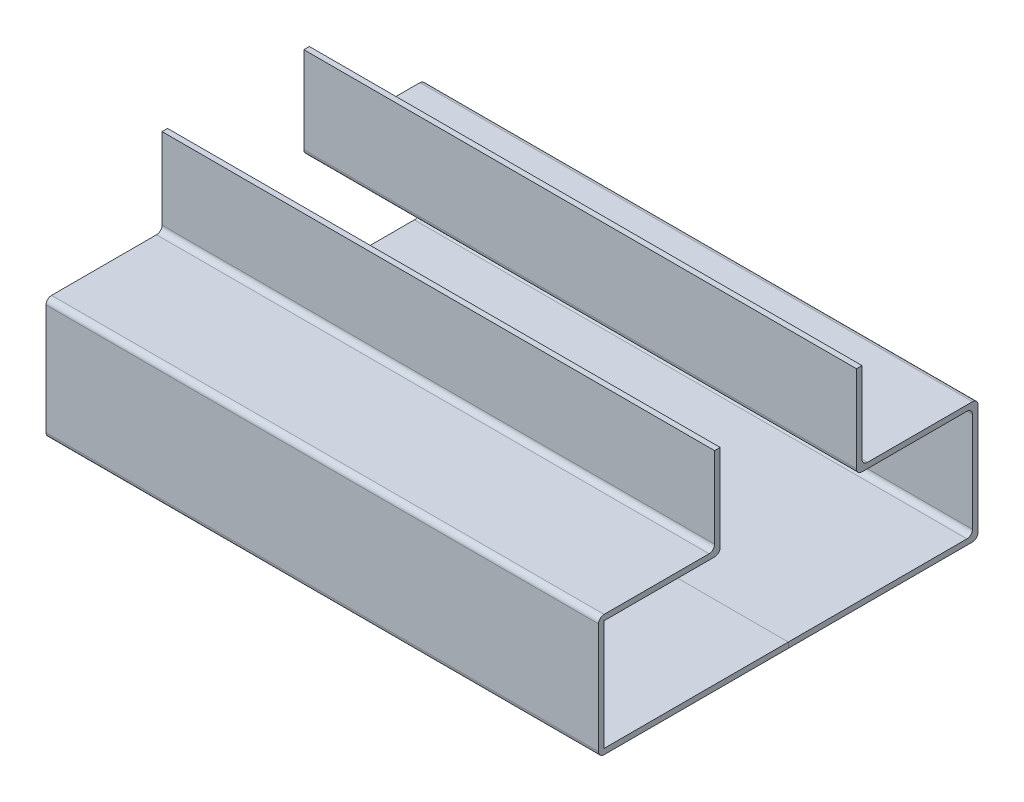
ISO-10303-21;
HEADER;
FILE_DESCRIPTION(('STEP AP214'),'2;1');
FILE_NAME('part.step','',(''),(''),'','','');
FILE_SCHEMA(('AUTOMOTIVE_DESIGN { 1 0 10303 214 1 1 1 1 }'));
ENDSEC;
DATA;
#1=APPLICATION_CONTEXT('core data for automotive mechanical design processes');
#2=APPLICATION_PROTOCOL_DEFINITION('international standard','automotive_design',2000,#1);
#3=PRODUCT_CONTEXT('',#1,'mechanical');
#4=PRODUCT('Part','Part','',(#3));
#5=PRODUCT_RELATED_PRODUCT_CATEGORY('part','',(#4));
#6=PRODUCT_DEFINITION_FORMATION('','',#4);
#7=PRODUCT_DEFINITION_CONTEXT('part definition',#1,'design');
#8=PRODUCT_DEFINITION('design','',#6,#7);
#9=PRODUCT_DEFINITION_SHAPE('','',#8);
#10=(LENGTH_UNIT() NAMED_UNIT(*) SI_UNIT(.MILLI.,.METRE.));
#11=(NAMED_UNIT(*) PLANE_ANGLE_UNIT() SI_UNIT($,.RADIAN.));
#12=(NAMED_UNIT(*) SI_UNIT($,.STERADIAN.) SOLID_ANGLE_UNIT());
#13=UNCERTAINTY_MEASURE_WITH_UNIT(LENGTH_MEASURE(1.E-05),#10,'distance_accuracy_value','');
#14=(GEOMETRIC_REPRESENTATION_CONTEXT(3) GLOBAL_UNCERTAINTY_ASSIGNED_CONTEXT((#13)) GLOBAL_UNIT_ASSIGNED_CONTEXT((#10,
#11,#12)) REPRESENTATION_CONTEXT('',''));
#15=CARTESIAN_POINT('',(0.,0.,0.));
#16=DIRECTION('',(0.,0.,1.));
#17=DIRECTION('',(1.,0.,0.));
#18=AXIS2_PLACEMENT_3D('',#15,#16,#17);
#19=CARTESIAN_POINT('',(-75.,0.,-50.));
#20=DIRECTION('',(0.,0.,1.));
#21=DIRECTION('',(-1.,0.,0.));
#22=AXIS2_PLACEMENT_3D('',#19,#20,#21);
#23=PLANE('',#22);
#24=DIRECTION('',(0.,1.,0.));
#25=VECTOR('',#24,1.);
#26=CARTESIAN_POINT('',(-75.,0.,-50.));
#27=LINE('',#26,#25);
#28=CARTESIAN_POINT('',(-75.,1.5,-50.));
#29=VERTEX_POINT('',#28);
#30=CARTESIAN_POINT('',(-75.,28.5,-50.));
#31=VERTEX_POINT('',#30);
#32=EDGE_CURVE('E228',#29,#31,#27,.T.);
#33=ORIENTED_EDGE('',*,*,#32,.F.);
#34=DIRECTION('',(1.,0.,0.));
#35=VECTOR('',#34,1.);
#36=CARTESIAN_POINT('',(-75.,1.5,-50.));
#37=LINE('',#36,#35);
#38=CARTESIAN_POINT('',(75.,1.5,-50.));
#39=VERTEX_POINT('',#38);
#40=EDGE_CURVE('E204',#29,#39,#37,.T.);
#41=ORIENTED_EDGE('',*,*,#40,.T.);
#42=DIRECTION('',(0.,1.,0.));
#43=VECTOR('',#42,1.);
#44=CARTESIAN_POINT('',(75.,0.,-50.));
#45=LINE('',#44,#43);
#46=CARTESIAN_POINT('',(75.,28.5,-50.));
#47=VERTEX_POINT('',#46);
#48=EDGE_CURVE('E217',#39,#47,#45,.T.);
#49=ORIENTED_EDGE('',*,*,#48,.T.);
#50=DIRECTION('',(1.,0.,0.));
#51=VECTOR('',#50,1.);
#52=CARTESIAN_POINT('',(-75.,28.5,-50.));
#53=LINE('',#52,#51);
#54=EDGE_CURVE('E202',#47,#31,#53,.F.);
#55=ORIENTED_EDGE('',*,*,#54,.T.);
#56=EDGE_LOOP('',(#33,#41,#49,#55));
#57=FACE_BOUND('',#56,.T.);
#58=ADVANCED_FACE('F47',(#57),#23,.T.);
#59=CARTESIAN_POINT('',(-75.,0.,0.));
#60=DIRECTION('',(0.,-1.,0.));
#61=DIRECTION('',(0.,0.,1.));
#62=AXIS2_PLACEMENT_3D('',#59,#60,#61);
#63=PLANE('',#62);
#64=DIRECTION('',(0.,0.,1.));
#65=VECTOR('',#64,1.);
#66=CARTESIAN_POINT('',(75.,0.,0.));
#67=LINE('',#66,#65);
#68=CARTESIAN_POINT('',(75.,0.,-48.5));
#69=VERTEX_POINT('',#68);
#70=CARTESIAN_POINT('',(75.,0.,0.));
#71=VERTEX_POINT('',#70);
#72=EDGE_CURVE('E231',#69,#71,#67,.T.);
#73=ORIENTED_EDGE('',*,*,#72,.F.);
#74=DIRECTION('',(1.,0.,0.));
#75=VECTOR('',#74,1.);
#76=CARTESIAN_POINT('',(-75.,0.,-48.5));
#77=LINE('',#76,#75);
#78=CARTESIAN_POINT('',(-75.,0.,-48.5));
#79=VERTEX_POINT('',#78);
#80=EDGE_CURVE('E207',#69,#79,#77,.F.);
#81=ORIENTED_EDGE('',*,*,#80,.T.);
#82=DIRECTION('',(0.,0.,1.));
#83=VECTOR('',#82,1.);
#84=CARTESIAN_POINT('',(-75.,0.,0.));
#85=LINE('',#84,#83);
#86=CARTESIAN_POINT('',(-75.,0.,0.));
#87=VERTEX_POINT('',#86);
#88=EDGE_CURVE('E185',#79,#87,#85,.T.);
#89=ORIENTED_EDGE('',*,*,#88,.T.);
#90=DIRECTION('',(1.,0.,0.));
#91=VECTOR('',#90,1.);
#92=CARTESIAN_POINT('',(-75.,0.,0.));
#93=LINE('',#92,#91);
#94=EDGE_CURVE('E195',#87,#71,#93,.T.);
#95=ORIENTED_EDGE('',*,*,#94,.T.);
#96=EDGE_LOOP('',(#73,#81,#89,#95));
#97=FACE_BOUND('',#96,.T.);
#98=ADVANCED_FACE('F308',(#97),#63,.F.);
#99=CARTESIAN_POINT('',(-75.,0.,0.));
#100=DIRECTION('',(0.,0.,1.));
#101=DIRECTION('',(-1.,0.,0.));
#102=AXIS2_PLACEMENT_3D('',#99,#100,#101);
#103=PLANE('',#102);
#104=ORIENTED_EDGE('',*,*,#94,.F.);
#105=DIRECTION('',(0.,1.,0.));
#106=VECTOR('',#105,1.);
#107=CARTESIAN_POINT('',(-75.,0.,0.));
#108=LINE('',#107,#106);
#109=CARTESIAN_POINT('',(-75.,-1.5,0.));
#110=VERTEX_POINT('',#109);
#111=EDGE_CURVE('E189',#110,#87,#108,.T.);
#112=ORIENTED_EDGE('',*,*,#111,.F.);
#113=DIRECTION('',(1.,0.,0.));
#114=VECTOR('',#113,1.);
#115=CARTESIAN_POINT('',(-75.,-1.5,0.));
#116=LINE('',#115,#114);
#117=CARTESIAN_POINT('',(75.,-1.5,0.));
#118=VERTEX_POINT('',#117);
#119=EDGE_CURVE('E255',#110,#118,#116,.T.);
#120=ORIENTED_EDGE('',*,*,#119,.T.);
#121=DIRECTION('',(0.,1.,0.));
#122=VECTOR('',#121,1.);
#123=CARTESIAN_POINT('',(75.,0.,0.));
#124=LINE('',#123,#122);
#125=EDGE_CURVE('E296',#118,#71,#124,.T.);
#126=ORIENTED_EDGE('',*,*,#125,.T.);
#127=EDGE_LOOP('',(#104,#112,#120,#126));
#128=FACE_BOUND('',#127,.T.);
#129=ADVANCED_FACE('F305',(#128),#103,.T.);
#130=CARTESIAN_POINT('',(-75.,-1.5,0.));
#131=DIRECTION('',(0.,-1.,0.));
#132=DIRECTION('',(0.,0.,1.));
#133=AXIS2_PLACEMENT_3D('',#130,#131,#132);
#134=PLANE('',#133);
#135=ORIENTED_EDGE('',*,*,#119,.F.);
#136=DIRECTION('',(0.,0.,1.));
#137=VECTOR('',#136,1.);
#138=CARTESIAN_POINT('',(-75.,-1.5,0.));
#139=LINE('',#138,#137);
#140=CARTESIAN_POINT('',(-75.,-1.5,-50.));
#141=VERTEX_POINT('',#140);
#142=EDGE_CURVE('E249',#141,#110,#139,.T.);
#143=ORIENTED_EDGE('',*,*,#142,.F.);
#144=DIRECTION('',(1.,0.,0.));
#145=VECTOR('',#144,1.);
#146=CARTESIAN_POINT('',(-75.,-1.5,-50.));
#147=LINE('',#146,#145);
#148=CARTESIAN_POINT('',(75.,-1.5,-50.));
#149=VERTEX_POINT('',#148);
#150=EDGE_CURVE('E258',#141,#149,#147,.T.);
#151=ORIENTED_EDGE('',*,*,#150,.T.);
#152=DIRECTION('',(0.,0.,1.));
#153=VECTOR('',#152,1.);
#154=CARTESIAN_POINT('',(75.,-1.5,0.));
#155=LINE('',#154,#153);
#156=EDGE_CURVE('E294',#149,#118,#155,.T.);
#157=ORIENTED_EDGE('',*,*,#156,.T.);
#158=EDGE_LOOP('',(#135,#143,#151,#157));
#159=FACE_BOUND('',#158,.T.);
#160=ADVANCED_FACE('F316',(#159),#134,.T.);
#161=CARTESIAN_POINT('',(-75.,0.,-50.));
#162=DIRECTION('',(1.,0.,0.));
#163=DIRECTION('',(0.,0.,1.));
#164=AXIS2_PLACEMENT_3D('',#161,#162,#163);
#165=CYLINDRICAL_SURFACE('',#164,1.5);
#166=ORIENTED_EDGE('',*,*,#150,.F.);
#167=CARTESIAN_POINT('',(-75.,0.,-50.));
#168=DIRECTION('',(-1.,0.,0.));
#169=DIRECTION('',(0.,0.,1.));
#170=AXIS2_PLACEMENT_3D('',#167,#168,#169);
#171=CIRCLE('',#170,1.5);
#172=CARTESIAN_POINT('',(-75.,0.,-51.5));
#173=VERTEX_POINT('',#172);
#174=EDGE_CURVE('E247',#173,#141,#171,.T.);
#175=ORIENTED_EDGE('',*,*,#174,.F.);
#176=DIRECTION('',(1.,0.,0.));
#177=VECTOR('',#176,1.);
#178=CARTESIAN_POINT('',(-75.,0.,-51.5));
#179=LINE('',#178,#177);
#180=CARTESIAN_POINT('',(75.,0.,-51.5));
#181=VERTEX_POINT('',#180);
#182=EDGE_CURVE('E261',#173,#181,#179,.T.);
#183=ORIENTED_EDGE('',*,*,#182,.T.);
#184=CARTESIAN_POINT('',(75.,0.,-50.));
#185=DIRECTION('',(-1.,0.,0.));
#186=DIRECTION('',(0.,0.,1.));
#187=AXIS2_PLACEMENT_3D('',#184,#185,#186);
#188=CIRCLE('',#187,1.5);
#189=EDGE_CURVE('E292',#181,#149,#188,.T.);
#190=ORIENTED_EDGE('',*,*,#189,.T.);
#191=EDGE_LOOP('',(#166,#175,#183,#190));
#192=FACE_BOUND('',#191,.T.);
#193=ADVANCED_FACE('F321',(#192),#165,.T.);
#194=CARTESIAN_POINT('',(-75.,0.,-51.5));
#195=DIRECTION('',(0.,0.,-1.));
#196=DIRECTION('',(1.,0.,0.));
#197=AXIS2_PLACEMENT_3D('',#194,#195,#196);
#198=PLANE('',#197);
#199=ORIENTED_EDGE('',*,*,#182,.F.);
#200=DIRECTION('',(0.,-1.,0.));
#201=VECTOR('',#200,1.);
#202=CARTESIAN_POINT('',(-75.,0.,-51.5));
#203=LINE('',#202,#201);
#204=CARTESIAN_POINT('',(-75.,30.,-51.5));
#205=VERTEX_POINT('',#204);
#206=EDGE_CURVE('E245',#205,#173,#203,.T.);
#207=ORIENTED_EDGE('',*,*,#206,.F.);
#208=DIRECTION('',(1.,0.,0.));
#209=VECTOR('',#208,1.);
#210=CARTESIAN_POINT('',(-75.,30.,-51.5));
#211=LINE('',#210,#209);
#212=CARTESIAN_POINT('',(75.,30.,-51.5));
#213=VERTEX_POINT('',#212);
#214=EDGE_CURVE('E264',#205,#213,#211,.T.);
#215=ORIENTED_EDGE('',*,*,#214,.T.);
#216=DIRECTION('',(0.,-1.,0.));
#217=VECTOR('',#216,1.);
#218=CARTESIAN_POINT('',(75.,0.,-51.5));
#219=LINE('',#218,#217);
#220=EDGE_CURVE('E290',#213,#181,#219,.T.);
#221=ORIENTED_EDGE('',*,*,#220,.T.);
#222=EDGE_LOOP('',(#199,#207,#215,#221));
#223=FACE_BOUND('',#222,.T.);
#224=ADVANCED_FACE('F324',(#223),#198,.T.);
#225=CARTESIAN_POINT('',(-75.,30.,-50.));
#226=DIRECTION('',(1.,0.,0.));
#227=DIRECTION('',(0.,0.,1.));
#228=AXIS2_PLACEMENT_3D('',#225,#226,#227);
#229=CYLINDRICAL_SURFACE('',#228,1.50000000000002);
#230=ORIENTED_EDGE('',*,*,#214,.F.);
#231=CARTESIAN_POINT('',(-75.,30.,-50.));
#232=DIRECTION('',(-1.,0.,0.));
#233=DIRECTION('',(0.,0.,1.));
#234=AXIS2_PLACEMENT_3D('',#231,#232,#233);
#235=CIRCLE('',#234,1.50000000000002);
#236=CARTESIAN_POINT('',(-75.,31.5,-50.));
#237=VERTEX_POINT('',#236);
#238=EDGE_CURVE('E243',#237,#205,#235,.T.);
#239=ORIENTED_EDGE('',*,*,#238,.F.);
#240=DIRECTION('',(1.,0.,0.));
#241=VECTOR('',#240,1.);
#242=CARTESIAN_POINT('',(-75.,31.5,-50.));
#243=LINE('',#242,#241);
#244=CARTESIAN_POINT('',(75.,31.5,-50.));
#245=VERTEX_POINT('',#244);
#246=EDGE_CURVE('E267',#237,#245,#243,.T.);
#247=ORIENTED_EDGE('',*,*,#246,.T.);
#248=CARTESIAN_POINT('',(75.,30.,-50.));
#249=DIRECTION('',(-1.,0.,0.));
#250=DIRECTION('',(0.,0.,1.));
#251=AXIS2_PLACEMENT_3D('',#248,#249,#250);
#252=CIRCLE('',#251,1.50000000000002);
#253=EDGE_CURVE('E286',#245,#213,#252,.T.);
#254=ORIENTED_EDGE('',*,*,#253,.T.);
#255=EDGE_LOOP('',(#230,#239,#247,#254));
#256=FACE_BOUND('',#255,.T.);
#257=ADVANCED_FACE('F328',(#256),#229,.T.);
#258=CARTESIAN_POINT('',(-75.,31.5,0.));
#259=DIRECTION('',(0.,1.,0.));
#260=DIRECTION('',(0.,0.,-1.));
#261=AXIS2_PLACEMENT_3D('',#258,#259,#260);
#262=PLANE('',#261);
#263=ORIENTED_EDGE('',*,*,#246,.F.);
#264=DIRECTION('',(0.,0.,-1.));
#265=VECTOR('',#264,1.);
#266=CARTESIAN_POINT('',(-75.,31.5,0.));
#267=LINE('',#266,#265);
#268=CARTESIAN_POINT('',(-75.,31.5,-21.5));
#269=VERTEX_POINT('',#268);
#270=EDGE_CURVE('E241',#269,#237,#267,.T.);
#271=ORIENTED_EDGE('',*,*,#270,.F.);
#272=DIRECTION('',(1.,0.,0.));
#273=VECTOR('',#272,1.);
#274=CARTESIAN_POINT('',(-75.,31.5,-21.5));
#275=LINE('',#274,#273);
#276=CARTESIAN_POINT('',(75.,31.5,-21.5));
#277=VERTEX_POINT('',#276);
#278=EDGE_CURVE('E270',#269,#277,#275,.T.);
#279=ORIENTED_EDGE('',*,*,#278,.T.);
#280=DIRECTION('',(0.,0.,-1.));
#281=VECTOR('',#280,1.);
#282=CARTESIAN_POINT('',(75.,31.5,0.));
#283=LINE('',#282,#281);
#284=EDGE_CURVE('E284',#277,#245,#283,.T.);
#285=ORIENTED_EDGE('',*,*,#284,.T.);
#286=EDGE_LOOP('',(#263,#271,#279,#285));
#287=FACE_BOUND('',#286,.T.);
#288=ADVANCED_FACE('F332',(#287),#262,.T.);
#289=CARTESIAN_POINT('',(-75.,33.,-21.5));
#290=DIRECTION('',(1.,0.,0.));
#291=DIRECTION('',(0.,0.,1.));
#292=AXIS2_PLACEMENT_3D('',#289,#290,#291);
#293=CYLINDRICAL_SURFACE('',#292,1.49999999999998);
#294=ORIENTED_EDGE('',*,*,#278,.F.);
#295=CARTESIAN_POINT('',(-75.,33.,-21.5));
#296=DIRECTION('',(-1.,0.,0.));
#297=DIRECTION('',(0.,0.,1.));
#298=AXIS2_PLACEMENT_3D('',#295,#296,#297);
#299=CIRCLE('',#298,1.49999999999998);
#300=CARTESIAN_POINT('',(-75.,33.,-20.));
#301=VERTEX_POINT('',#300);
#302=EDGE_CURVE('E238',#269,#301,#299,.T.);
#303=ORIENTED_EDGE('',*,*,#302,.T.);
#304=DIRECTION('',(1.,0.,0.));
#305=VECTOR('',#304,1.);
#306=CARTESIAN_POINT('',(-75.,33.,-20.));
#307=LINE('',#306,#305);
#308=CARTESIAN_POINT('',(75.,33.,-20.));
#309=VERTEX_POINT('',#308);
#310=EDGE_CURVE('E187',#301,#309,#307,.T.);
#311=ORIENTED_EDGE('',*,*,#310,.T.);
#312=CARTESIAN_POINT('',(75.,33.,-21.5));
#313=DIRECTION('',(-1.,0.,0.));
#314=DIRECTION('',(0.,0.,1.));
#315=AXIS2_PLACEMENT_3D('',#312,#313,#314);
#316=CIRCLE('',#315,1.49999999999998);
#317=EDGE_CURVE('E277',#277,#309,#316,.T.);
#318=ORIENTED_EDGE('',*,*,#317,.F.);
#319=EDGE_LOOP('',(#294,#303,#311,#318));
#320=FACE_BOUND('',#319,.T.);
#321=ADVANCED_FACE('F276',(#320),#293,.F.);
#322=CARTESIAN_POINT('',(-75.,0.,-20.));
#323=DIRECTION('',(0.,0.,-1.));
#324=DIRECTION('',(1.,0.,0.));
#325=AXIS2_PLACEMENT_3D('',#322,#323,#324);
#326=PLANE('',#325);
#327=ORIENTED_EDGE('',*,*,#310,.F.);
#328=DIRECTION('',(0.,-1.,0.));
#329=VECTOR('',#328,1.);
#330=CARTESIAN_POINT('',(-75.,0.,-20.));
#331=LINE('',#330,#329);
#332=CARTESIAN_POINT('',(-75.,55.,-20.));
#333=VERTEX_POINT('',#332);
#334=EDGE_CURVE('E236',#333,#301,#331,.T.);
#335=ORIENTED_EDGE('',*,*,#334,.F.);
#336=DIRECTION('',(1.,0.,0.));
#337=VECTOR('',#336,1.);
#338=CARTESIAN_POINT('',(-75.,55.,-20.));
#339=LINE('',#338,#337);
#340=CARTESIAN_POINT('',(75.,55.,-20.));
#341=VERTEX_POINT('',#340);
#342=EDGE_CURVE('E184',#333,#341,#339,.T.);
#343=ORIENTED_EDGE('',*,*,#342,.T.);
#344=DIRECTION('',(0.,-1.,0.));
#345=VECTOR('',#344,1.);
#346=CARTESIAN_POINT('',(75.,0.,-20.));
#347=LINE('',#346,#345);
#348=EDGE_CURVE('E177',#341,#309,#347,.T.);
#349=ORIENTED_EDGE('',*,*,#348,.T.);
#350=EDGE_LOOP('',(#327,#335,#343,#349));
#351=FACE_BOUND('',#350,.T.);
#352=ADVANCED_FACE('F281',(#351),#326,.T.);
#353=CARTESIAN_POINT('',(-75.,55.,0.));
#354=DIRECTION('',(0.,1.,0.));
#355=DIRECTION('',(0.,0.,-1.));
#356=AXIS2_PLACEMENT_3D('',#353,#354,#355);
#357=PLANE('',#356);
#358=ORIENTED_EDGE('',*,*,#342,.F.);
#359=DIRECTION('',(0.,0.,-1.));
#360=VECTOR('',#359,1.);
#361=CARTESIAN_POINT('',(-75.,55.,0.));
#362=LINE('',#361,#360);
#363=CARTESIAN_POINT('',(-75.,55.,-18.5));
#364=VERTEX_POINT('',#363);
#365=EDGE_CURVE('E183',#364,#333,#362,.T.);
#366=ORIENTED_EDGE('',*,*,#365,.F.);
#367=DIRECTION('',(1.,0.,0.));
#368=VECTOR('',#367,1.);
#369=CARTESIAN_POINT('',(-75.,55.,-18.5));
#370=LINE('',#369,#368);
#371=CARTESIAN_POINT('',(75.,55.,-18.5));
#372=VERTEX_POINT('',#371);
#373=EDGE_CURVE('E165',#364,#372,#370,.T.);
#374=ORIENTED_EDGE('',*,*,#373,.T.);
#375=DIRECTION('',(0.,0.,-1.));
#376=VECTOR('',#375,1.);
#377=CARTESIAN_POINT('',(75.,55.,0.));
#378=LINE('',#377,#376);
#379=EDGE_CURVE('E171',#372,#341,#378,.T.);
#380=ORIENTED_EDGE('',*,*,#379,.T.);
#381=EDGE_LOOP('',(#358,#366,#374,#380));
#382=FACE_BOUND('',#381,.T.);
#383=ADVANCED_FACE('F182',(#382),#357,.T.);
#384=CARTESIAN_POINT('',(-75.,0.,-18.5));
#385=DIRECTION('',(0.,0.,1.));
#386=DIRECTION('',(-1.,0.,0.));
#387=AXIS2_PLACEMENT_3D('',#384,#385,#386);
#388=PLANE('',#387);
#389=DIRECTION('',(0.,1.,0.));
#390=VECTOR('',#389,1.);
#391=CARTESIAN_POINT('',(-75.,0.,-18.5));
#392=LINE('',#391,#390);
#393=CARTESIAN_POINT('',(-75.,31.5,-18.5));
#394=VERTEX_POINT('',#393);
#395=EDGE_CURVE('E227',#394,#364,#392,.T.);
#396=ORIENTED_EDGE('',*,*,#395,.F.);
#397=DIRECTION('',(1.,0.,0.));
#398=VECTOR('',#397,1.);
#399=CARTESIAN_POINT('',(-75.,31.5,-18.5));
#400=LINE('',#399,#398);
#401=CARTESIAN_POINT('',(75.,31.5,-18.5));
#402=VERTEX_POINT('',#401);
#403=EDGE_CURVE('E168',#394,#402,#400,.T.);
#404=ORIENTED_EDGE('',*,*,#403,.T.);
#405=DIRECTION('',(0.,1.,0.));
#406=VECTOR('',#405,1.);
#407=CARTESIAN_POINT('',(75.,0.,-18.5));
#408=LINE('',#407,#406);
#409=EDGE_CURVE('E160',#402,#372,#408,.T.);
#410=ORIENTED_EDGE('',*,*,#409,.T.);
#411=ORIENTED_EDGE('',*,*,#373,.F.);
#412=EDGE_LOOP('',(#396,#404,#410,#411));
#413=FACE_BOUND('',#412,.T.);
#414=ADVANCED_FACE('F163',(#413),#388,.T.);
#415=CARTESIAN_POINT('',(-75.,30.,0.));
#416=DIRECTION('',(0.,-1.,0.));
#417=DIRECTION('',(0.,0.,1.));
#418=AXIS2_PLACEMENT_3D('',#415,#416,#417);
#419=PLANE('',#418);
#420=DIRECTION('',(0.,0.,1.));
#421=VECTOR('',#420,1.);
#422=CARTESIAN_POINT('',(-75.,30.,0.));
#423=LINE('',#422,#421);
#424=CARTESIAN_POINT('',(-75.,30.,-48.5));
#425=VERTEX_POINT('',#424);
#426=CARTESIAN_POINT('',(-75.,30.,-20.));
#427=VERTEX_POINT('',#426);
#428=EDGE_CURVE('E224',#425,#427,#423,.T.);
#429=ORIENTED_EDGE('',*,*,#428,.F.);
#430=DIRECTION('',(1.,0.,0.));
#431=VECTOR('',#430,1.);
#432=CARTESIAN_POINT('',(75.,30.,-48.5));
#433=LINE('',#432,#431);
#434=CARTESIAN_POINT('',(75.,30.,-48.5));
#435=VERTEX_POINT('',#434);
#436=EDGE_CURVE('E209',#425,#435,#433,.T.);
#437=ORIENTED_EDGE('',*,*,#436,.T.);
#438=DIRECTION('',(0.,0.,1.));
#439=VECTOR('',#438,1.);
#440=CARTESIAN_POINT('',(75.,30.,0.));
#441=LINE('',#440,#439);
#442=CARTESIAN_POINT('',(75.,30.,-20.));
#443=VERTEX_POINT('',#442);
#444=EDGE_CURVE('E172',#435,#443,#441,.T.);
#445=ORIENTED_EDGE('',*,*,#444,.T.);
#446=DIRECTION('',(1.,0.,0.));
#447=VECTOR('',#446,1.);
#448=CARTESIAN_POINT('',(-75.,30.,-20.));
#449=LINE('',#448,#447);
#450=EDGE_CURVE('E197',#443,#427,#449,.F.);
#451=ORIENTED_EDGE('',*,*,#450,.T.);
#452=EDGE_LOOP('',(#429,#437,#445,#451));
#453=FACE_BOUND('',#452,.T.);
#454=ADVANCED_FACE('F223',(#453),#419,.T.);
#455=CARTESIAN_POINT('',(-75.,0.,0.));
#456=DIRECTION('',(1.,0.,0.));
#457=DIRECTION('',(0.,0.,1.));
#458=AXIS2_PLACEMENT_3D('',#455,#456,#457);
#459=PLANE('',#458);
#460=ORIENTED_EDGE('',*,*,#32,.T.);
#461=CARTESIAN_POINT('',(-75.,28.5,-48.5));
#462=DIRECTION('',(1.,0.,0.));
#463=DIRECTION('',(0.,0.,-1.));
#464=AXIS2_PLACEMENT_3D('',#461,#462,#463);
#465=CIRCLE('',#464,1.5);
#466=EDGE_CURVE('E12',#31,#425,#465,.T.);
#467=ORIENTED_EDGE('',*,*,#466,.T.);
#468=ORIENTED_EDGE('',*,*,#428,.T.);
#469=CARTESIAN_POINT('',(-75.,31.5,-20.));
#470=DIRECTION('',(1.,0.,0.));
#471=DIRECTION('',(0.,0.,-1.));
#472=AXIS2_PLACEMENT_3D('',#469,#470,#471);
#473=CIRCLE('',#472,1.5);
#474=EDGE_CURVE('E200',#427,#394,#473,.F.);
#475=ORIENTED_EDGE('',*,*,#474,.T.);
#476=ORIENTED_EDGE('',*,*,#395,.T.);
#477=ORIENTED_EDGE('',*,*,#365,.T.);
#478=ORIENTED_EDGE('',*,*,#334,.T.);
#479=ORIENTED_EDGE('',*,*,#302,.F.);
#480=ORIENTED_EDGE('',*,*,#270,.T.);
#481=ORIENTED_EDGE('',*,*,#238,.T.);
#482=ORIENTED_EDGE('',*,*,#206,.T.);
#483=ORIENTED_EDGE('',*,*,#174,.T.);
#484=ORIENTED_EDGE('',*,*,#142,.T.);
#485=ORIENTED_EDGE('',*,*,#111,.T.);
#486=ORIENTED_EDGE('',*,*,#88,.F.);
#487=CARTESIAN_POINT('',(-75.,1.5,-48.5));
#488=DIRECTION('',(1.,0.,0.));
#489=DIRECTION('',(0.,0.,-1.));
#490=AXIS2_PLACEMENT_3D('',#487,#488,#489);
#491=CIRCLE('',#490,1.5);
#492=EDGE_CURVE('E213',#79,#29,#491,.T.);
#493=ORIENTED_EDGE('',*,*,#492,.T.);
#494=EDGE_LOOP('',(#460,#467,#468,#475,#476,#477,#478,#479,#480,#481,#482,#483,#484,#485,#486,#493));
#495=FACE_BOUND('',#494,.T.);
#496=ADVANCED_FACE('F311',(#495),#459,.F.);
#497=CARTESIAN_POINT('',(75.,0.,0.));
#498=DIRECTION('',(1.,0.,0.));
#499=DIRECTION('',(0.,0.,1.));
#500=AXIS2_PLACEMENT_3D('',#497,#498,#499);
#501=PLANE('',#500);
#502=ORIENTED_EDGE('',*,*,#409,.F.);
#503=CARTESIAN_POINT('',(75.,31.5,-20.));
#504=DIRECTION('',(1.,0.,0.));
#505=DIRECTION('',(0.,0.,-1.));
#506=AXIS2_PLACEMENT_3D('',#503,#504,#505);
#507=CIRCLE('',#506,1.5);
#508=EDGE_CURVE('E194',#402,#443,#507,.T.);
#509=ORIENTED_EDGE('',*,*,#508,.T.);
#510=ORIENTED_EDGE('',*,*,#444,.F.);
#511=CARTESIAN_POINT('',(75.,28.5,-48.5));
#512=DIRECTION('',(1.,0.,0.));
#513=DIRECTION('',(0.,0.,-1.));
#514=AXIS2_PLACEMENT_3D('',#511,#512,#513);
#515=CIRCLE('',#514,1.5);
#516=EDGE_CURVE('E55',#435,#47,#515,.F.);
#517=ORIENTED_EDGE('',*,*,#516,.T.);
#518=ORIENTED_EDGE('',*,*,#48,.F.);
#519=CARTESIAN_POINT('',(75.,1.5,-48.5));
#520=DIRECTION('',(1.,0.,0.));
#521=DIRECTION('',(0.,0.,-1.));
#522=AXIS2_PLACEMENT_3D('',#519,#520,#521);
#523=CIRCLE('',#522,1.5);
#524=EDGE_CURVE('E211',#39,#69,#523,.F.);
#525=ORIENTED_EDGE('',*,*,#524,.T.);
#526=ORIENTED_EDGE('',*,*,#72,.T.);
#527=ORIENTED_EDGE('',*,*,#125,.F.);
#528=ORIENTED_EDGE('',*,*,#156,.F.);
#529=ORIENTED_EDGE('',*,*,#189,.F.);
#530=ORIENTED_EDGE('',*,*,#220,.F.);
#531=ORIENTED_EDGE('',*,*,#253,.F.);
#532=ORIENTED_EDGE('',*,*,#284,.F.);
#533=ORIENTED_EDGE('',*,*,#317,.T.);
#534=ORIENTED_EDGE('',*,*,#348,.F.);
#535=ORIENTED_EDGE('',*,*,#379,.F.);
#536=EDGE_LOOP('',(#502,#509,#510,#517,#518,#525,#526,#527,#528,#529,#530,#531,#532,#533,#534,#535));
#537=FACE_BOUND('',#536,.T.);
#538=ADVANCED_FACE('F175',(#537),#501,.T.);
#539=CARTESIAN_POINT('',(-75.,31.5,-20.));
#540=DIRECTION('',(1.,0.,0.));
#541=DIRECTION('',(0.,0.,-1.));
#542=AXIS2_PLACEMENT_3D('',#539,#540,#541);
#543=CYLINDRICAL_SURFACE('',#542,1.5);
#544=ORIENTED_EDGE('',*,*,#474,.F.);
#545=ORIENTED_EDGE('',*,*,#450,.F.);
#546=ORIENTED_EDGE('',*,*,#508,.F.);
#547=ORIENTED_EDGE('',*,*,#403,.F.);
#548=EDGE_LOOP('',(#544,#545,#546,#547));
#549=FACE_BOUND('',#548,.T.);
#550=ADVANCED_FACE('F334',(#549),#543,.T.);
#551=CARTESIAN_POINT('',(-75.,1.5,-48.5));
#552=DIRECTION('',(1.,0.,0.));
#553=DIRECTION('',(0.,0.,-1.));
#554=AXIS2_PLACEMENT_3D('',#551,#552,#553);
#555=CYLINDRICAL_SURFACE('',#554,1.5);
#556=ORIENTED_EDGE('',*,*,#492,.F.);
#557=ORIENTED_EDGE('',*,*,#80,.F.);
#558=ORIENTED_EDGE('',*,*,#524,.F.);
#559=ORIENTED_EDGE('',*,*,#40,.F.);
#560=EDGE_LOOP('',(#556,#557,#558,#559));
#561=FACE_BOUND('',#560,.T.);
#562=ADVANCED_FACE('F336',(#561),#555,.F.);
#563=CARTESIAN_POINT('',(-75.,28.5,-48.5));
#564=DIRECTION('',(-1.,0.,0.));
#565=DIRECTION('',(0.,0.,1.));
#566=AXIS2_PLACEMENT_3D('',#563,#564,#565);
#567=CYLINDRICAL_SURFACE('',#566,1.5);
#568=ORIENTED_EDGE('',*,*,#466,.F.);
#569=ORIENTED_EDGE('',*,*,#54,.F.);
#570=ORIENTED_EDGE('',*,*,#516,.F.);
#571=ORIENTED_EDGE('',*,*,#436,.F.);
#572=EDGE_LOOP('',(#568,#569,#570,#571));
#573=FACE_BOUND('',#572,.T.);
#574=ADVANCED_FACE('F49',(#573),#567,.F.);
#575=CLOSED_SHELL('',(#58,#98,#129,#160,#193,#224,#257,#288,#321,#352,#383,#414,#454,#496,#538,
#550,#562,#574));
#576=MANIFOLD_SOLID_BREP('B2',#575);
#577=CARTESIAN_POINT('',(-75.,0.,50.));
#578=DIRECTION('',(0.,0.,-1.));
#579=DIRECTION('',(-1.,0.,0.));
#580=AXIS2_PLACEMENT_3D('',#577,#578,#579);
#581=PLANE('',#580);
#582=DIRECTION('',(1.,0.,0.));
#583=VECTOR('',#582,1.);
#584=CARTESIAN_POINT('',(-75.,30.,50.));
#585=LINE('',#584,#583);
#586=CARTESIAN_POINT('',(-75.,30.,50.));
#587=VERTEX_POINT('',#586);
#588=CARTESIAN_POINT('',(75.,30.,50.));
#589=VERTEX_POINT('',#588);
#590=EDGE_CURVE('E605',#587,#589,#585,.T.);
#591=ORIENTED_EDGE('',*,*,#590,.T.);
#592=DIRECTION('',(0.,1.,0.));
#593=VECTOR('',#592,1.);
#594=CARTESIAN_POINT('',(75.,0.,50.));
#595=LINE('',#594,#593);
#596=CARTESIAN_POINT('',(75.,0.,50.));
#597=VERTEX_POINT('',#596);
#598=EDGE_CURVE('E608',#597,#589,#595,.T.);
#599=ORIENTED_EDGE('',*,*,#598,.F.);
#600=DIRECTION('',(1.,0.,0.));
#601=VECTOR('',#600,1.);
#602=CARTESIAN_POINT('',(-75.,0.,50.));
#603=LINE('',#602,#601);
#604=CARTESIAN_POINT('',(-75.,0.,50.));
#605=VERTEX_POINT('',#604);
#606=EDGE_CURVE('E691',#605,#597,#603,.T.);
#607=ORIENTED_EDGE('',*,*,#606,.F.);
#608=DIRECTION('',(0.,1.,0.));
#609=VECTOR('',#608,1.);
#610=CARTESIAN_POINT('',(-75.,0.,50.));
#611=LINE('',#610,#609);
#612=EDGE_CURVE('E611',#605,#587,#611,.T.);
#613=ORIENTED_EDGE('',*,*,#612,.T.);
#614=EDGE_LOOP('',(#591,#599,#607,#613));
#615=FACE_BOUND('',#614,.T.);
#616=ADVANCED_FACE('F506',(#615),#581,.T.);
#617=CARTESIAN_POINT('',(-75.,0.,0.));
#618=DIRECTION('',(0.,-1.,0.));
#619=DIRECTION('',(0.,0.,-1.));
#620=AXIS2_PLACEMENT_3D('',#617,#618,#619);
#621=PLANE('',#620);
#622=ORIENTED_EDGE('',*,*,#606,.T.);
#623=DIRECTION('',(0.,0.,-1.));
#624=VECTOR('',#623,1.);
#625=CARTESIAN_POINT('',(75.,0.,0.));
#626=LINE('',#625,#624);
#627=CARTESIAN_POINT('',(75.,0.,0.));
#628=VERTEX_POINT('',#627);
#629=EDGE_CURVE('E628',#597,#628,#626,.T.);
#630=ORIENTED_EDGE('',*,*,#629,.T.);
#631=DIRECTION('',(1.,0.,0.));
#632=VECTOR('',#631,1.);
#633=CARTESIAN_POINT('',(-75.,0.,0.));
#634=LINE('',#633,#632);
#635=CARTESIAN_POINT('',(-75.,0.,0.));
#636=VERTEX_POINT('',#635);
#637=EDGE_CURVE('E693',#636,#628,#634,.T.);
#638=ORIENTED_EDGE('',*,*,#637,.F.);
#639=DIRECTION('',(0.,0.,-1.));
#640=VECTOR('',#639,1.);
#641=CARTESIAN_POINT('',(-75.,0.,0.));
#642=LINE('',#641,#640);
#643=EDGE_CURVE('E616',#605,#636,#642,.T.);
#644=ORIENTED_EDGE('',*,*,#643,.F.);
#645=EDGE_LOOP('',(#622,#630,#638,#644));
#646=FACE_BOUND('',#645,.T.);
#647=ADVANCED_FACE('F757',(#646),#621,.F.);
#648=CARTESIAN_POINT('',(-75.,0.,0.));
#649=DIRECTION('',(0.,0.,-1.));
#650=DIRECTION('',(-1.,0.,0.));
#651=AXIS2_PLACEMENT_3D('',#648,#649,#650);
#652=PLANE('',#651);
#653=ORIENTED_EDGE('',*,*,#637,.T.);
#654=DIRECTION('',(0.,1.,0.));
#655=VECTOR('',#654,1.);
#656=CARTESIAN_POINT('',(75.,0.,0.));
#657=LINE('',#656,#655);
#658=CARTESIAN_POINT('',(75.,-1.5,0.));
#659=VERTEX_POINT('',#658);
#660=EDGE_CURVE('E656',#659,#628,#657,.T.);
#661=ORIENTED_EDGE('',*,*,#660,.F.);
#662=DIRECTION('',(1.,0.,0.));
#663=VECTOR('',#662,1.);
#664=CARTESIAN_POINT('',(-75.,-1.5,0.));
#665=LINE('',#664,#663);
#666=CARTESIAN_POINT('',(-75.,-1.5,0.));
#667=VERTEX_POINT('',#666);
#668=EDGE_CURVE('E695',#667,#659,#665,.T.);
#669=ORIENTED_EDGE('',*,*,#668,.F.);
#670=DIRECTION('',(0.,1.,0.));
#671=VECTOR('',#670,1.);
#672=CARTESIAN_POINT('',(-75.,0.,0.));
#673=LINE('',#672,#671);
#674=EDGE_CURVE('E687',#667,#636,#673,.T.);
#675=ORIENTED_EDGE('',*,*,#674,.T.);
#676=EDGE_LOOP('',(#653,#661,#669,#675));
#677=FACE_BOUND('',#676,.T.);
#678=ADVANCED_FACE('F753',(#677),#652,.T.);
#679=CARTESIAN_POINT('',(-75.,-1.5,0.));
#680=DIRECTION('',(0.,-1.,0.));
#681=DIRECTION('',(0.,0.,-1.));
#682=AXIS2_PLACEMENT_3D('',#679,#680,#681);
#683=PLANE('',#682);
#684=ORIENTED_EDGE('',*,*,#668,.T.);
#685=DIRECTION('',(0.,0.,-1.));
#686=VECTOR('',#685,1.);
#687=CARTESIAN_POINT('',(75.,-1.5,0.));
#688=LINE('',#687,#686);
#689=CARTESIAN_POINT('',(75.,-1.5,50.));
#690=VERTEX_POINT('',#689);
#691=EDGE_CURVE('E653',#690,#659,#688,.T.);
#692=ORIENTED_EDGE('',*,*,#691,.F.);
#693=DIRECTION('',(1.,0.,0.));
#694=VECTOR('',#693,1.);
#695=CARTESIAN_POINT('',(-75.,-1.5,50.));
#696=LINE('',#695,#694);
#697=CARTESIAN_POINT('',(-75.,-1.5,50.));
#698=VERTEX_POINT('',#697);
#699=EDGE_CURVE('E697',#698,#690,#696,.T.);
#700=ORIENTED_EDGE('',*,*,#699,.F.);
#701=DIRECTION('',(0.,0.,-1.));
#702=VECTOR('',#701,1.);
#703=CARTESIAN_POINT('',(-75.,-1.5,0.));
#704=LINE('',#703,#702);
#705=EDGE_CURVE('E684',#698,#667,#704,.T.);
#706=ORIENTED_EDGE('',*,*,#705,.T.);
#707=EDGE_LOOP('',(#684,#692,#700,#706));
#708=FACE_BOUND('',#707,.T.);
#709=ADVANCED_FACE('F751',(#708),#683,.T.);
#710=CARTESIAN_POINT('',(-75.,0.,50.));
#711=DIRECTION('',(1.,0.,0.));
#712=DIRECTION('',(0.,0.,-1.));
#713=AXIS2_PLACEMENT_3D('',#710,#711,#712);
#714=CYLINDRICAL_SURFACE('',#713,1.5);
#715=ORIENTED_EDGE('',*,*,#699,.T.);
#716=CARTESIAN_POINT('',(75.,0.,50.));
#717=DIRECTION('',(1.,0.,0.));
#718=DIRECTION('',(0.,0.,-1.));
#719=AXIS2_PLACEMENT_3D('',#716,#717,#718);
#720=CIRCLE('',#719,1.5);
#721=CARTESIAN_POINT('',(75.,0.,51.5));
#722=VERTEX_POINT('',#721);
#723=EDGE_CURVE('E650',#722,#690,#720,.T.);
#724=ORIENTED_EDGE('',*,*,#723,.F.);
#725=DIRECTION('',(1.,0.,0.));
#726=VECTOR('',#725,1.);
#727=CARTESIAN_POINT('',(-75.,0.,51.5));
#728=LINE('',#727,#726);
#729=CARTESIAN_POINT('',(-75.,0.,51.5));
#730=VERTEX_POINT('',#729);
#731=EDGE_CURVE('E699',#730,#722,#728,.T.);
#732=ORIENTED_EDGE('',*,*,#731,.F.);
#733=CARTESIAN_POINT('',(-75.,0.,50.));
#734=DIRECTION('',(1.,0.,0.));
#735=DIRECTION('',(0.,0.,-1.));
#736=AXIS2_PLACEMENT_3D('',#733,#734,#735);
#737=CIRCLE('',#736,1.5);
#738=EDGE_CURVE('E681',#730,#698,#737,.T.);
#739=ORIENTED_EDGE('',*,*,#738,.T.);
#740=EDGE_LOOP('',(#715,#724,#732,#739));
#741=FACE_BOUND('',#740,.T.);
#742=ADVANCED_FACE('F746',(#741),#714,.T.);
#743=CARTESIAN_POINT('',(-75.,0.,51.5));
#744=DIRECTION('',(0.,0.,1.));
#745=DIRECTION('',(1.,0.,0.));
#746=AXIS2_PLACEMENT_3D('',#743,#744,#745);
#747=PLANE('',#746);
#748=ORIENTED_EDGE('',*,*,#731,.T.);
#749=DIRECTION('',(0.,-1.,0.));
#750=VECTOR('',#749,1.);
#751=CARTESIAN_POINT('',(75.,0.,51.5));
#752=LINE('',#751,#750);
#753=CARTESIAN_POINT('',(75.,30.,51.5));
#754=VERTEX_POINT('',#753);
#755=EDGE_CURVE('E647',#754,#722,#752,.T.);
#756=ORIENTED_EDGE('',*,*,#755,.F.);
#757=DIRECTION('',(1.,0.,0.));
#758=VECTOR('',#757,1.);
#759=CARTESIAN_POINT('',(-75.,30.,51.5));
#760=LINE('',#759,#758);
#761=CARTESIAN_POINT('',(-75.,30.,51.5));
#762=VERTEX_POINT('',#761);
#763=EDGE_CURVE('E701',#762,#754,#760,.T.);
#764=ORIENTED_EDGE('',*,*,#763,.F.);
#765=DIRECTION('',(0.,-1.,0.));
#766=VECTOR('',#765,1.);
#767=CARTESIAN_POINT('',(-75.,0.,51.5));
#768=LINE('',#767,#766);
#769=EDGE_CURVE('E678',#762,#730,#768,.T.);
#770=ORIENTED_EDGE('',*,*,#769,.T.);
#771=EDGE_LOOP('',(#748,#756,#764,#770));
#772=FACE_BOUND('',#771,.T.);
#773=ADVANCED_FACE('F739',(#772),#747,.T.);
#774=CARTESIAN_POINT('',(-75.,30.,50.));
#775=DIRECTION('',(1.,0.,0.));
#776=DIRECTION('',(0.,0.,-1.));
#777=AXIS2_PLACEMENT_3D('',#774,#775,#776);
#778=CYLINDRICAL_SURFACE('',#777,1.50000000000002);
#779=ORIENTED_EDGE('',*,*,#763,.T.);
#780=CARTESIAN_POINT('',(75.,30.,50.));
#781=DIRECTION('',(1.,0.,0.));
#782=DIRECTION('',(0.,0.,-1.));
#783=AXIS2_PLACEMENT_3D('',#780,#781,#782);
#784=CIRCLE('',#783,1.50000000000002);
#785=CARTESIAN_POINT('',(75.,31.5,50.));
#786=VERTEX_POINT('',#785);
#787=EDGE_CURVE('E644',#786,#754,#784,.T.);
#788=ORIENTED_EDGE('',*,*,#787,.F.);
#789=DIRECTION('',(1.,0.,0.));
#790=VECTOR('',#789,1.);
#791=CARTESIAN_POINT('',(-75.,31.5,50.));
#792=LINE('',#791,#790);
#793=CARTESIAN_POINT('',(-75.,31.5,50.));
#794=VERTEX_POINT('',#793);
#795=EDGE_CURVE('E703',#794,#786,#792,.T.);
#796=ORIENTED_EDGE('',*,*,#795,.F.);
#797=CARTESIAN_POINT('',(-75.,30.,50.));
#798=DIRECTION('',(1.,0.,0.));
#799=DIRECTION('',(0.,0.,-1.));
#800=AXIS2_PLACEMENT_3D('',#797,#798,#799);
#801=CIRCLE('',#800,1.50000000000002);
#802=EDGE_CURVE('E675',#794,#762,#801,.T.);
#803=ORIENTED_EDGE('',*,*,#802,.T.);
#804=EDGE_LOOP('',(#779,#788,#796,#803));
#805=FACE_BOUND('',#804,.T.);
#806=ADVANCED_FACE('F735',(#805),#778,.T.);
#807=CARTESIAN_POINT('',(-75.,31.5,0.));
#808=DIRECTION('',(0.,1.,0.));
#809=DIRECTION('',(0.,0.,1.));
#810=AXIS2_PLACEMENT_3D('',#807,#808,#809);
#811=PLANE('',#810);
#812=ORIENTED_EDGE('',*,*,#795,.T.);
#813=DIRECTION('',(0.,0.,1.));
#814=VECTOR('',#813,1.);
#815=CARTESIAN_POINT('',(75.,31.5,0.));
#816=LINE('',#815,#814);
#817=CARTESIAN_POINT('',(75.,31.5,21.5));
#818=VERTEX_POINT('',#817);
#819=EDGE_CURVE('E641',#818,#786,#816,.T.);
#820=ORIENTED_EDGE('',*,*,#819,.F.);
#821=DIRECTION('',(1.,0.,0.));
#822=VECTOR('',#821,1.);
#823=CARTESIAN_POINT('',(-75.,31.5,21.5));
#824=LINE('',#823,#822);
#825=CARTESIAN_POINT('',(-75.,31.5,21.5));
#826=VERTEX_POINT('',#825);
#827=EDGE_CURVE('E705',#826,#818,#824,.T.);
#828=ORIENTED_EDGE('',*,*,#827,.F.);
#829=DIRECTION('',(0.,0.,1.));
#830=VECTOR('',#829,1.);
#831=CARTESIAN_POINT('',(-75.,31.5,0.));
#832=LINE('',#831,#830);
#833=EDGE_CURVE('E672',#826,#794,#832,.T.);
#834=ORIENTED_EDGE('',*,*,#833,.T.);
#835=EDGE_LOOP('',(#812,#820,#828,#834));
#836=FACE_BOUND('',#835,.T.);
#837=ADVANCED_FACE('F776',(#836),#811,.T.);
#838=CARTESIAN_POINT('',(-75.,33.,21.5));
#839=DIRECTION('',(1.,0.,0.));
#840=DIRECTION('',(0.,0.,-1.));
#841=AXIS2_PLACEMENT_3D('',#838,#839,#840);
#842=CYLINDRICAL_SURFACE('',#841,1.49999999999998);
#843=ORIENTED_EDGE('',*,*,#827,.T.);
#844=CARTESIAN_POINT('',(75.,33.,21.5));
#845=DIRECTION('',(1.,0.,0.));
#846=DIRECTION('',(0.,0.,-1.));
#847=AXIS2_PLACEMENT_3D('',#844,#845,#846);
#848=CIRCLE('',#847,1.49999999999998);
#849=CARTESIAN_POINT('',(75.,33.,20.));
#850=VERTEX_POINT('',#849);
#851=EDGE_CURVE('E638',#818,#850,#848,.T.);
#852=ORIENTED_EDGE('',*,*,#851,.T.);
#853=DIRECTION('',(1.,0.,0.));
#854=VECTOR('',#853,1.);
#855=CARTESIAN_POINT('',(-75.,33.,20.));
#856=LINE('',#855,#854);
#857=CARTESIAN_POINT('',(-75.,33.,20.));
#858=VERTEX_POINT('',#857);
#859=EDGE_CURVE('E707',#858,#850,#856,.T.);
#860=ORIENTED_EDGE('',*,*,#859,.F.);
#861=CARTESIAN_POINT('',(-75.,33.,21.5));
#862=DIRECTION('',(1.,0.,0.));
#863=DIRECTION('',(0.,0.,-1.));
#864=AXIS2_PLACEMENT_3D('',#861,#862,#863);
#865=CIRCLE('',#864,1.49999999999998);
#866=EDGE_CURVE('E670',#826,#858,#865,.T.);
#867=ORIENTED_EDGE('',*,*,#866,.F.);
#868=EDGE_LOOP('',(#843,#852,#860,#867));
#869=FACE_BOUND('',#868,.T.);
#870=ADVANCED_FACE('F728',(#869),#842,.F.);
#871=CARTESIAN_POINT('',(-75.,0.,20.));
#872=DIRECTION('',(0.,0.,1.));
#873=DIRECTION('',(1.,0.,0.));
#874=AXIS2_PLACEMENT_3D('',#871,#872,#873);
#875=PLANE('',#874);
#876=ORIENTED_EDGE('',*,*,#859,.T.);
#877=DIRECTION('',(0.,-1.,0.));
#878=VECTOR('',#877,1.);
#879=CARTESIAN_POINT('',(75.,0.,20.));
#880=LINE('',#879,#878);
#881=CARTESIAN_POINT('',(75.,55.,20.));
#882=VERTEX_POINT('',#881);
#883=EDGE_CURVE('E635',#882,#850,#880,.T.);
#884=ORIENTED_EDGE('',*,*,#883,.F.);
#885=DIRECTION('',(1.,0.,0.));
#886=VECTOR('',#885,1.);
#887=CARTESIAN_POINT('',(-75.,55.,20.));
#888=LINE('',#887,#886);
#889=CARTESIAN_POINT('',(-75.,55.,20.));
#890=VERTEX_POINT('',#889);
#891=EDGE_CURVE('E709',#890,#882,#888,.T.);
#892=ORIENTED_EDGE('',*,*,#891,.F.);
#893=DIRECTION('',(0.,-1.,0.));
#894=VECTOR('',#893,1.);
#895=CARTESIAN_POINT('',(-75.,0.,20.));
#896=LINE('',#895,#894);
#897=EDGE_CURVE('E667',#890,#858,#896,.T.);
#898=ORIENTED_EDGE('',*,*,#897,.T.);
#899=EDGE_LOOP('',(#876,#884,#892,#898));
#900=FACE_BOUND('',#899,.T.);
#901=ADVANCED_FACE('F723',(#900),#875,.T.);
#902=CARTESIAN_POINT('',(-75.,55.,0.));
#903=DIRECTION('',(0.,1.,0.));
#904=DIRECTION('',(0.,0.,1.));
#905=AXIS2_PLACEMENT_3D('',#902,#903,#904);
#906=PLANE('',#905);
#907=ORIENTED_EDGE('',*,*,#891,.T.);
#908=DIRECTION('',(0.,0.,1.));
#909=VECTOR('',#908,1.);
#910=CARTESIAN_POINT('',(75.,55.,0.));
#911=LINE('',#910,#909);
#912=CARTESIAN_POINT('',(75.,55.,18.5));
#913=VERTEX_POINT('',#912);
#914=EDGE_CURVE('E632',#913,#882,#911,.T.);
#915=ORIENTED_EDGE('',*,*,#914,.F.);
#916=DIRECTION('',(1.,0.,0.));
#917=VECTOR('',#916,1.);
#918=CARTESIAN_POINT('',(-75.,55.,18.5));
#919=LINE('',#918,#917);
#920=CARTESIAN_POINT('',(-75.,55.,18.5));
#921=VERTEX_POINT('',#920);
#922=EDGE_CURVE('E615',#921,#913,#919,.T.);
#923=ORIENTED_EDGE('',*,*,#922,.F.);
#924=DIRECTION('',(0.,0.,1.));
#925=VECTOR('',#924,1.);
#926=CARTESIAN_POINT('',(-75.,55.,0.));
#927=LINE('',#926,#925);
#928=EDGE_CURVE('E664',#921,#890,#927,.T.);
#929=ORIENTED_EDGE('',*,*,#928,.T.);
#930=EDGE_LOOP('',(#907,#915,#923,#929));
#931=FACE_BOUND('',#930,.T.);
#932=ADVANCED_FACE('F719',(#931),#906,.T.);
#933=CARTESIAN_POINT('',(-75.,0.,18.5));
#934=DIRECTION('',(0.,0.,-1.));
#935=DIRECTION('',(-1.,0.,0.));
#936=AXIS2_PLACEMENT_3D('',#933,#934,#935);
#937=PLANE('',#936);
#938=DIRECTION('',(0.,1.,0.));
#939=VECTOR('',#938,1.);
#940=CARTESIAN_POINT('',(75.,0.,18.5));
#941=LINE('',#940,#939);
#942=CARTESIAN_POINT('',(75.,31.5,18.5));
#943=VERTEX_POINT('',#942);
#944=EDGE_CURVE('E623',#943,#913,#941,.T.);
#945=ORIENTED_EDGE('',*,*,#944,.F.);
#946=DIRECTION('',(1.,0.,0.));
#947=VECTOR('',#946,1.);
#948=CARTESIAN_POINT('',(-75.,31.5,18.5));
#949=LINE('',#948,#947);
#950=CARTESIAN_POINT('',(-75.,31.5,18.5));
#951=VERTEX_POINT('',#950);
#952=EDGE_CURVE('E514',#943,#951,#949,.F.);
#953=ORIENTED_EDGE('',*,*,#952,.T.);
#954=DIRECTION('',(0.,1.,0.));
#955=VECTOR('',#954,1.);
#956=CARTESIAN_POINT('',(-75.,0.,18.5));
#957=LINE('',#956,#955);
#958=EDGE_CURVE('E662',#951,#921,#957,.T.);
#959=ORIENTED_EDGE('',*,*,#958,.T.);
#960=ORIENTED_EDGE('',*,*,#922,.T.);
#961=EDGE_LOOP('',(#945,#953,#959,#960));
#962=FACE_BOUND('',#961,.T.);
#963=ADVANCED_FACE('F716',(#962),#937,.T.);
#964=CARTESIAN_POINT('',(-75.,30.,0.));
#965=DIRECTION('',(0.,-1.,0.));
#966=DIRECTION('',(0.,0.,-1.));
#967=AXIS2_PLACEMENT_3D('',#964,#965,#966);
#968=PLANE('',#967);
#969=DIRECTION('',(0.,0.,-1.));
#970=VECTOR('',#969,1.);
#971=CARTESIAN_POINT('',(-75.,30.,0.));
#972=LINE('',#971,#970);
#973=CARTESIAN_POINT('',(-75.,30.,20.));
#974=VERTEX_POINT('',#973);
#975=EDGE_CURVE('E660',#587,#974,#972,.T.);
#976=ORIENTED_EDGE('',*,*,#975,.T.);
#977=DIRECTION('',(1.,0.,0.));
#978=VECTOR('',#977,1.);
#979=CARTESIAN_POINT('',(-75.,30.,20.));
#980=LINE('',#979,#978);
#981=CARTESIAN_POINT('',(75.,30.,20.));
#982=VERTEX_POINT('',#981);
#983=EDGE_CURVE('E622',#974,#982,#980,.T.);
#984=ORIENTED_EDGE('',*,*,#983,.T.);
#985=DIRECTION('',(0.,0.,-1.));
#986=VECTOR('',#985,1.);
#987=CARTESIAN_POINT('',(75.,30.,0.));
#988=LINE('',#987,#986);
#989=EDGE_CURVE('E619',#589,#982,#988,.T.);
#990=ORIENTED_EDGE('',*,*,#989,.F.);
#991=ORIENTED_EDGE('',*,*,#590,.F.);
#992=EDGE_LOOP('',(#976,#984,#990,#991));
#993=FACE_BOUND('',#992,.T.);
#994=ADVANCED_FACE('F620',(#993),#968,.T.);
#995=CARTESIAN_POINT('',(-75.,0.,0.));
#996=DIRECTION('',(1.,0.,0.));
#997=DIRECTION('',(0.,0.,-1.));
#998=AXIS2_PLACEMENT_3D('',#995,#996,#997);
#999=PLANE('',#998);
#1000=ORIENTED_EDGE('',*,*,#958,.F.);
#1001=CARTESIAN_POINT('',(-75.,31.5,20.));
#1002=DIRECTION('',(1.,0.,0.));
#1003=DIRECTION('',(0.,0.,-1.));
#1004=AXIS2_PLACEMENT_3D('',#1001,#1002,#1003);
#1005=CIRCLE('',#1004,1.5);
#1006=EDGE_CURVE('E45',#951,#974,#1005,.F.);
#1007=ORIENTED_EDGE('',*,*,#1006,.T.);
#1008=ORIENTED_EDGE('',*,*,#975,.F.);
#1009=ORIENTED_EDGE('',*,*,#612,.F.);
#1010=ORIENTED_EDGE('',*,*,#643,.T.);
#1011=ORIENTED_EDGE('',*,*,#674,.F.);
#1012=ORIENTED_EDGE('',*,*,#705,.F.);
#1013=ORIENTED_EDGE('',*,*,#738,.F.);
#1014=ORIENTED_EDGE('',*,*,#769,.F.);
#1015=ORIENTED_EDGE('',*,*,#802,.F.);
#1016=ORIENTED_EDGE('',*,*,#833,.F.);
#1017=ORIENTED_EDGE('',*,*,#866,.T.);
#1018=ORIENTED_EDGE('',*,*,#897,.F.);
#1019=ORIENTED_EDGE('',*,*,#928,.F.);
#1020=EDGE_LOOP('',(#1000,#1007,#1008,#1009,#1010,#1011,#1012,#1013,#1014,#1015,#1016,#1017,
#1018,#1019));
#1021=FACE_BOUND('',#1020,.T.);
#1022=ADVANCED_FACE('F742',(#1021),#999,.F.);
#1023=CARTESIAN_POINT('',(75.,0.,0.));
#1024=DIRECTION('',(1.,0.,0.));
#1025=DIRECTION('',(0.,0.,-1.));
#1026=AXIS2_PLACEMENT_3D('',#1023,#1024,#1025);
#1027=PLANE('',#1026);
#1028=ORIENTED_EDGE('',*,*,#989,.T.);
#1029=CARTESIAN_POINT('',(75.,31.5,20.));
#1030=DIRECTION('',(1.,0.,0.));
#1031=DIRECTION('',(0.,0.,-1.));
#1032=AXIS2_PLACEMENT_3D('',#1029,#1030,#1031);
#1033=CIRCLE('',#1032,1.5);
#1034=EDGE_CURVE('E528',#982,#943,#1033,.T.);
#1035=ORIENTED_EDGE('',*,*,#1034,.T.);
#1036=ORIENTED_EDGE('',*,*,#944,.T.);
#1037=ORIENTED_EDGE('',*,*,#914,.T.);
#1038=ORIENTED_EDGE('',*,*,#883,.T.);
#1039=ORIENTED_EDGE('',*,*,#851,.F.);
#1040=ORIENTED_EDGE('',*,*,#819,.T.);
#1041=ORIENTED_EDGE('',*,*,#787,.T.);
#1042=ORIENTED_EDGE('',*,*,#755,.T.);
#1043=ORIENTED_EDGE('',*,*,#723,.T.);
#1044=ORIENTED_EDGE('',*,*,#691,.T.);
#1045=ORIENTED_EDGE('',*,*,#660,.T.);
#1046=ORIENTED_EDGE('',*,*,#629,.F.);
#1047=ORIENTED_EDGE('',*,*,#598,.T.);
#1048=EDGE_LOOP('',(#1028,#1035,#1036,#1037,#1038,#1039,#1040,#1041,#1042,#1043,#1044,#1045,
#1046,#1047));
#1049=FACE_BOUND('',#1048,.T.);
#1050=ADVANCED_FACE('F625',(#1049),#1027,.T.);
#1051=CARTESIAN_POINT('',(-75.,31.5,20.));
#1052=DIRECTION('',(1.,0.,0.));
#1053=DIRECTION('',(0.,0.,-1.));
#1054=AXIS2_PLACEMENT_3D('',#1051,#1052,#1053);
#1055=CYLINDRICAL_SURFACE('',#1054,1.5);
#1056=ORIENTED_EDGE('',*,*,#1006,.F.);
#1057=ORIENTED_EDGE('',*,*,#952,.F.);
#1058=ORIENTED_EDGE('',*,*,#1034,.F.);
#1059=ORIENTED_EDGE('',*,*,#983,.F.);
#1060=EDGE_LOOP('',(#1056,#1057,#1058,#1059));
#1061=FACE_BOUND('',#1060,.T.);
#1062=ADVANCED_FACE('F508',(#1061),#1055,.T.);
#1063=CLOSED_SHELL('',(#616,#647,#678,#709,#742,#773,#806,#837,#870,#901,#932,#963,#994,#1022,
#1050,#1062));
#1064=MANIFOLD_SOLID_BREP('B6',#1063);
#1065=ADVANCED_BREP_SHAPE_REPRESENTATION('',(#18,#576,#1064),#14);
#1066=SHAPE_DEFINITION_REPRESENTATION(#9,#1065);
ENDSEC;
END-ISO-10303-21;
